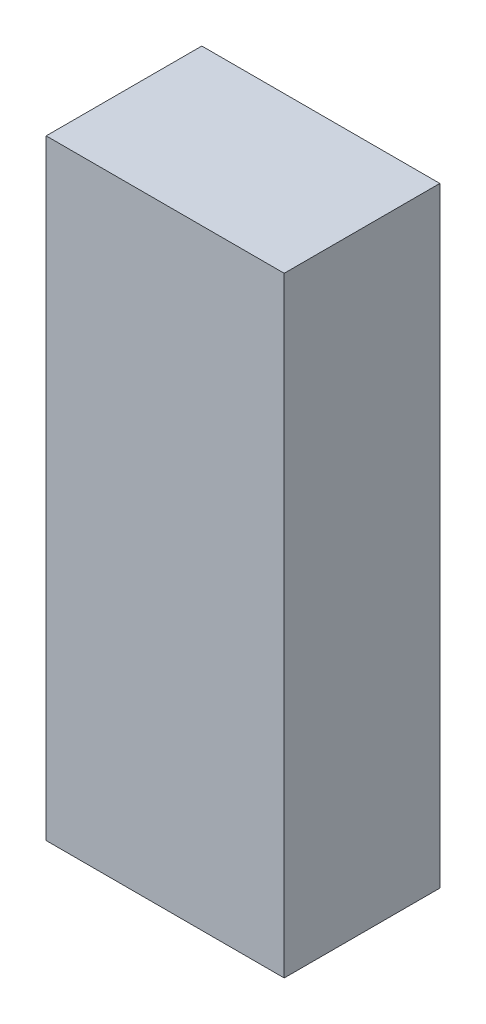
ISO-10303-21;
HEADER;
FILE_DESCRIPTION(('STEP AP214'),'2;1');
FILE_NAME('part.step','',(''),(''),'','','');
FILE_SCHEMA(('AUTOMOTIVE_DESIGN { 1 0 10303 214 1 1 1 1 }'));
ENDSEC;
DATA;
#1=APPLICATION_CONTEXT('core data for automotive mechanical design processes');
#2=APPLICATION_PROTOCOL_DEFINITION('international standard','automotive_design',2000,#1);
#3=PRODUCT_CONTEXT('',#1,'mechanical');
#4=PRODUCT('Part','Part','',(#3));
#5=PRODUCT_RELATED_PRODUCT_CATEGORY('part','',(#4));
#6=PRODUCT_DEFINITION_FORMATION('','',#4);
#7=PRODUCT_DEFINITION_CONTEXT('part definition',#1,'design');
#8=PRODUCT_DEFINITION('design','',#6,#7);
#9=PRODUCT_DEFINITION_SHAPE('','',#8);
#10=(LENGTH_UNIT() NAMED_UNIT(*) SI_UNIT(.MILLI.,.METRE.));
#11=(NAMED_UNIT(*) PLANE_ANGLE_UNIT() SI_UNIT($,.RADIAN.));
#12=(NAMED_UNIT(*) SI_UNIT($,.STERADIAN.) SOLID_ANGLE_UNIT());
#13=UNCERTAINTY_MEASURE_WITH_UNIT(LENGTH_MEASURE(1.E-05),#10,'distance_accuracy_value','');
#14=(GEOMETRIC_REPRESENTATION_CONTEXT(3) GLOBAL_UNCERTAINTY_ASSIGNED_CONTEXT((#13)) GLOBAL_UNIT_ASSIGNED_CONTEXT((#10,
#11,#12)) REPRESENTATION_CONTEXT('',''));
#15=CARTESIAN_POINT('',(0.,0.,0.));
#16=DIRECTION('',(0.,0.,1.));
#17=DIRECTION('',(1.,0.,0.));
#18=AXIS2_PLACEMENT_3D('',#15,#16,#17);
#19=CARTESIAN_POINT('',(-1.95000118,5.00000016,2.54999998));
#20=DIRECTION('',(0.,0.,-1.));
#21=DIRECTION('',(-1.,0.,0.));
#22=AXIS2_PLACEMENT_3D('',#19,#20,#21);
#23=PLANE('',#22);
#24=DIRECTION('',(1.,0.,0.));
#25=VECTOR('',#24,1.);
#26=CARTESIAN_POINT('',(-1.95000118,-5.00000016,2.54999998));
#27=LINE('',#26,#25);
#28=CARTESIAN_POINT('',(-1.95000118,-5.00000016,2.54999998));
#29=VERTEX_POINT('',#28);
#30=CARTESIAN_POINT('',(1.94999864,-5.00000016,2.54999998));
#31=VERTEX_POINT('',#30);
#32=EDGE_CURVE('E55',#29,#31,#27,.T.);
#33=ORIENTED_EDGE('',*,*,#32,.T.);
#34=DIRECTION('',(0.,1.,0.));
#35=VECTOR('',#34,1.);
#36=CARTESIAN_POINT('',(1.94999864,-5.00000016,2.54999998));
#37=LINE('',#36,#35);
#38=CARTESIAN_POINT('',(1.94999864,5.00000016,2.54999998));
#39=VERTEX_POINT('',#38);
#40=EDGE_CURVE('E57',#31,#39,#37,.T.);
#41=ORIENTED_EDGE('',*,*,#40,.T.);
#42=DIRECTION('',(1.,0.,0.));
#43=VECTOR('',#42,1.);
#44=CARTESIAN_POINT('',(1.94999864,5.00000016,2.54999998));
#45=LINE('',#44,#43);
#46=CARTESIAN_POINT('',(-1.95000118,5.00000016,2.54999998));
#47=VERTEX_POINT('',#46);
#48=EDGE_CURVE('E20',#39,#47,#45,.F.);
#49=ORIENTED_EDGE('',*,*,#48,.T.);
#50=DIRECTION('',(0.,1.,0.));
#51=VECTOR('',#50,1.);
#52=CARTESIAN_POINT('',(-1.95000118,5.00000016,2.54999998));
#53=LINE('',#52,#51);
#54=EDGE_CURVE('E80',#47,#29,#53,.F.);
#55=ORIENTED_EDGE('',*,*,#54,.T.);
#56=EDGE_LOOP('',(#33,#41,#49,#55));
#57=FACE_BOUND('',#56,.T.);
#58=ADVANCED_FACE('F17',(#57),#23,.F.);
#59=CARTESIAN_POINT('',(1.94999864,5.00000016,0.));
#60=DIRECTION('',(0.,-1.,0.));
#61=DIRECTION('',(0.,0.,-1.));
#62=AXIS2_PLACEMENT_3D('',#59,#60,#61);
#63=PLANE('',#62);
#64=DIRECTION('',(0.,0.,-1.));
#65=VECTOR('',#64,1.);
#66=CARTESIAN_POINT('',(-1.95000118,5.00000016,0.));
#67=LINE('',#66,#65);
#68=CARTESIAN_POINT('',(-1.95000118,5.00000016,0.));
#69=VERTEX_POINT('',#68);
#70=EDGE_CURVE('E68',#69,#47,#67,.F.);
#71=ORIENTED_EDGE('',*,*,#70,.T.);
#72=ORIENTED_EDGE('',*,*,#48,.F.);
#73=DIRECTION('',(0.,0.,1.));
#74=VECTOR('',#73,1.);
#75=CARTESIAN_POINT('',(1.94999864,5.00000016,0.));
#76=LINE('',#75,#74);
#77=CARTESIAN_POINT('',(1.94999864,5.00000016,0.));
#78=VERTEX_POINT('',#77);
#79=EDGE_CURVE('E63',#39,#78,#76,.F.);
#80=ORIENTED_EDGE('',*,*,#79,.T.);
#81=DIRECTION('',(-1.,0.,0.));
#82=VECTOR('',#81,1.);
#83=CARTESIAN_POINT('',(-1.95000118,5.00000016,0.));
#84=LINE('',#83,#82);
#85=EDGE_CURVE('E83',#69,#78,#84,.F.);
#86=ORIENTED_EDGE('',*,*,#85,.F.);
#87=EDGE_LOOP('',(#71,#72,#80,#86));
#88=FACE_BOUND('',#87,.T.);
#89=ADVANCED_FACE('F65',(#88),#63,.F.);
#90=CARTESIAN_POINT('',(1.94999864,-5.00000016,0.));
#91=DIRECTION('',(-1.,0.,0.));
#92=DIRECTION('',(0.,0.,1.));
#93=AXIS2_PLACEMENT_3D('',#90,#91,#92);
#94=PLANE('',#93);
#95=ORIENTED_EDGE('',*,*,#79,.F.);
#96=ORIENTED_EDGE('',*,*,#40,.F.);
#97=DIRECTION('',(0.,0.,1.));
#98=VECTOR('',#97,1.);
#99=CARTESIAN_POINT('',(1.94999864,-5.00000016,0.));
#100=LINE('',#99,#98);
#101=CARTESIAN_POINT('',(1.94999864,-5.00000016,0.));
#102=VERTEX_POINT('',#101);
#103=EDGE_CURVE('E75',#31,#102,#100,.F.);
#104=ORIENTED_EDGE('',*,*,#103,.T.);
#105=DIRECTION('',(0.,1.,0.));
#106=VECTOR('',#105,1.);
#107=CARTESIAN_POINT('',(1.94999864,5.00000016,0.));
#108=LINE('',#107,#106);
#109=EDGE_CURVE('E72',#78,#102,#108,.F.);
#110=ORIENTED_EDGE('',*,*,#109,.F.);
#111=EDGE_LOOP('',(#95,#96,#104,#110));
#112=FACE_BOUND('',#111,.T.);
#113=ADVANCED_FACE('F70',(#112),#94,.F.);
#114=CARTESIAN_POINT('',(-1.95000118,-5.00000016,0.));
#115=DIRECTION('',(0.,1.,0.));
#116=DIRECTION('',(0.,0.,1.));
#117=AXIS2_PLACEMENT_3D('',#114,#115,#116);
#118=PLANE('',#117);
#119=ORIENTED_EDGE('',*,*,#103,.F.);
#120=ORIENTED_EDGE('',*,*,#32,.F.);
#121=DIRECTION('',(0.,0.,-1.));
#122=VECTOR('',#121,1.);
#123=CARTESIAN_POINT('',(-1.95000118,-5.00000016,0.));
#124=LINE('',#123,#122);
#125=CARTESIAN_POINT('',(-1.95000118,-5.00000016,0.));
#126=VERTEX_POINT('',#125);
#127=EDGE_CURVE('E35',#29,#126,#124,.T.);
#128=ORIENTED_EDGE('',*,*,#127,.T.);
#129=DIRECTION('',(-1.,0.,0.));
#130=VECTOR('',#129,1.);
#131=CARTESIAN_POINT('',(-1.95000118,-5.00000016,0.));
#132=LINE('',#131,#130);
#133=EDGE_CURVE('E26',#102,#126,#132,.T.);
#134=ORIENTED_EDGE('',*,*,#133,.F.);
#135=EDGE_LOOP('',(#119,#120,#128,#134));
#136=FACE_BOUND('',#135,.T.);
#137=ADVANCED_FACE('F89',(#136),#118,.F.);
#138=CARTESIAN_POINT('',(-1.95000118,5.00000016,0.));
#139=DIRECTION('',(1.,0.,0.));
#140=DIRECTION('',(0.,0.,-1.));
#141=AXIS2_PLACEMENT_3D('',#138,#139,#140);
#142=PLANE('',#141);
#143=ORIENTED_EDGE('',*,*,#127,.F.);
#144=ORIENTED_EDGE('',*,*,#54,.F.);
#145=ORIENTED_EDGE('',*,*,#70,.F.);
#146=DIRECTION('',(0.,1.,0.));
#147=VECTOR('',#146,1.);
#148=CARTESIAN_POINT('',(-1.95000118,5.00000016,0.));
#149=LINE('',#148,#147);
#150=EDGE_CURVE('E11',#126,#69,#149,.T.);
#151=ORIENTED_EDGE('',*,*,#150,.F.);
#152=EDGE_LOOP('',(#143,#144,#145,#151));
#153=FACE_BOUND('',#152,.T.);
#154=ADVANCED_FACE('F91',(#153),#142,.F.);
#155=CARTESIAN_POINT('',(-1.95000118,5.00000016,0.));
#156=DIRECTION('',(0.,0.,-1.));
#157=DIRECTION('',(-1.,0.,0.));
#158=AXIS2_PLACEMENT_3D('',#155,#156,#157);
#159=PLANE('',#158);
#160=ORIENTED_EDGE('',*,*,#133,.T.);
#161=ORIENTED_EDGE('',*,*,#150,.T.);
#162=ORIENTED_EDGE('',*,*,#85,.T.);
#163=ORIENTED_EDGE('',*,*,#109,.T.);
#164=EDGE_LOOP('',(#160,#161,#162,#163));
#165=FACE_BOUND('',#164,.T.);
#166=ADVANCED_FACE('F88',(#165),#159,.T.);
#167=CLOSED_SHELL('',(#58,#89,#113,#137,#154,#166));
#168=MANIFOLD_SOLID_BREP('B1',#167);
#169=ADVANCED_BREP_SHAPE_REPRESENTATION('',(#18,#168),#14);
#170=SHAPE_DEFINITION_REPRESENTATION(#9,#169);
ENDSEC;
END-ISO-10303-21;
